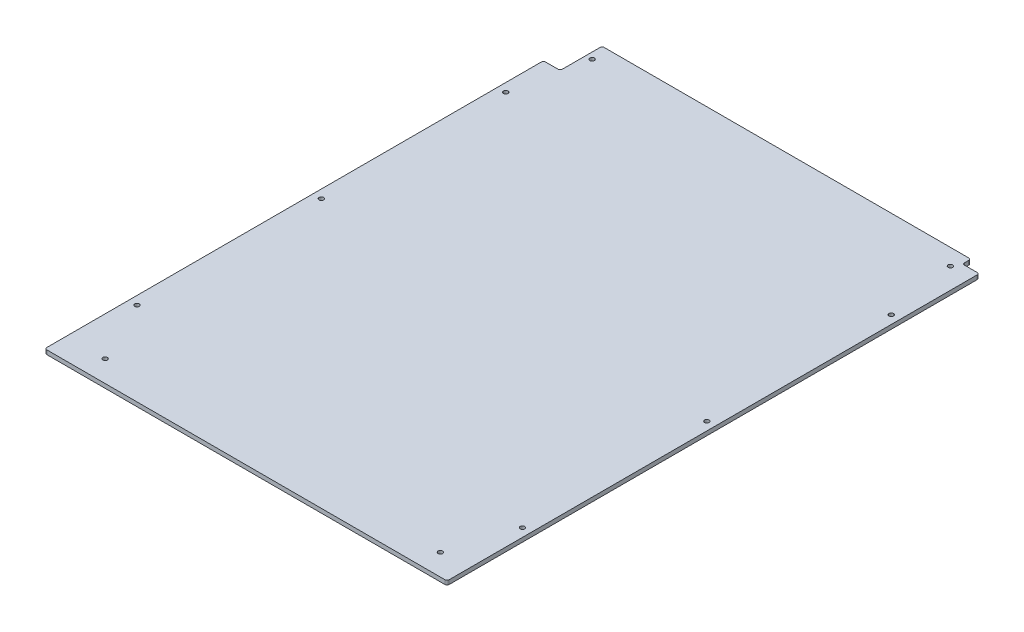
ISO-10303-21;
HEADER;
FILE_DESCRIPTION(('STEP AP214'),'2;1');
FILE_NAME('part.step','',(''),(''),'','','');
FILE_SCHEMA(('AUTOMOTIVE_DESIGN { 1 0 10303 214 1 1 1 1 }'));
ENDSEC;
DATA;
#1=APPLICATION_CONTEXT('core data for automotive mechanical design processes');
#2=APPLICATION_PROTOCOL_DEFINITION('international standard','automotive_design',2000,#1);
#3=PRODUCT_CONTEXT('',#1,'mechanical');
#4=PRODUCT('Part','Part','',(#3));
#5=PRODUCT_RELATED_PRODUCT_CATEGORY('part','',(#4));
#6=PRODUCT_DEFINITION_FORMATION('','',#4);
#7=PRODUCT_DEFINITION_CONTEXT('part definition',#1,'design');
#8=PRODUCT_DEFINITION('design','',#6,#7);
#9=PRODUCT_DEFINITION_SHAPE('','',#8);
#10=(LENGTH_UNIT() NAMED_UNIT(*) SI_UNIT(.MILLI.,.METRE.));
#11=(NAMED_UNIT(*) PLANE_ANGLE_UNIT() SI_UNIT($,.RADIAN.));
#12=(NAMED_UNIT(*) SI_UNIT($,.STERADIAN.) SOLID_ANGLE_UNIT());
#13=UNCERTAINTY_MEASURE_WITH_UNIT(LENGTH_MEASURE(1.E-05),#10,'distance_accuracy_value','');
#14=(GEOMETRIC_REPRESENTATION_CONTEXT(3) GLOBAL_UNCERTAINTY_ASSIGNED_CONTEXT((#13)) GLOBAL_UNIT_ASSIGNED_CONTEXT((#10,
#11,#12)) REPRESENTATION_CONTEXT('',''));
#15=CARTESIAN_POINT('',(0.,0.,0.));
#16=DIRECTION('',(0.,0.,1.));
#17=DIRECTION('',(1.,0.,0.));
#18=AXIS2_PLACEMENT_3D('',#15,#16,#17);
#19=CARTESIAN_POINT('',(0.,6.35,0.));
#20=DIRECTION('',(0.,-1.,0.));
#21=DIRECTION('',(0.,0.,-1.));
#22=AXIS2_PLACEMENT_3D('',#19,#20,#21);
#23=PLANE('',#22);
#24=DIRECTION('',(-1.,0.,0.));
#25=VECTOR('',#24,1.);
#26=CARTESIAN_POINT('',(25.4,6.35,-819.15));
#27=LINE('',#26,#25);
#28=CARTESIAN_POINT('',(581.025,6.35,-819.15));
#29=VERTEX_POINT('',#28);
#30=CARTESIAN_POINT('',(28.575,6.35,-819.15));
#31=VERTEX_POINT('',#30);
#32=EDGE_CURVE('E311',#29,#31,#27,.T.);
#33=ORIENTED_EDGE('',*,*,#32,.T.);
#34=CARTESIAN_POINT('',(28.575,6.35,-815.975));
#35=DIRECTION('',(0.,-1.,0.));
#36=DIRECTION('',(0.,0.,-1.));
#37=AXIS2_PLACEMENT_3D('',#34,#35,#36);
#38=CIRCLE('',#37,3.175);
#39=CARTESIAN_POINT('',(25.4,6.35,-815.975));
#40=VERTEX_POINT('',#39);
#41=EDGE_CURVE('E242',#31,#40,#38,.F.);
#42=ORIENTED_EDGE('',*,*,#41,.T.);
#43=DIRECTION('',(0.,0.,1.));
#44=VECTOR('',#43,1.);
#45=CARTESIAN_POINT('',(25.4,6.35,-755.65));
#46=LINE('',#45,#44);
#47=CARTESIAN_POINT('',(25.4,6.35,-758.825));
#48=VERTEX_POINT('',#47);
#49=EDGE_CURVE('E316',#40,#48,#46,.T.);
#50=ORIENTED_EDGE('',*,*,#49,.T.);
#51=CARTESIAN_POINT('',(22.225,6.35,-758.825));
#52=DIRECTION('',(0.,-1.,0.));
#53=DIRECTION('',(0.,0.,-1.));
#54=AXIS2_PLACEMENT_3D('',#51,#52,#53);
#55=CIRCLE('',#54,3.175);
#56=CARTESIAN_POINT('',(22.225,6.35,-755.65));
#57=VERTEX_POINT('',#56);
#58=EDGE_CURVE('E165',#48,#57,#55,.T.);
#59=ORIENTED_EDGE('',*,*,#58,.T.);
#60=DIRECTION('',(-1.,0.,0.));
#61=VECTOR('',#60,1.);
#62=CARTESIAN_POINT('',(0.,6.35,-755.65));
#63=LINE('',#62,#61);
#64=CARTESIAN_POINT('',(3.175,6.35,-755.65));
#65=VERTEX_POINT('',#64);
#66=EDGE_CURVE('E174',#57,#65,#63,.T.);
#67=ORIENTED_EDGE('',*,*,#66,.T.);
#68=CARTESIAN_POINT('',(3.175,6.35,-752.475));
#69=DIRECTION('',(0.,-1.,0.));
#70=DIRECTION('',(0.,0.,-1.));
#71=AXIS2_PLACEMENT_3D('',#68,#69,#70);
#72=CIRCLE('',#71,3.175);
#73=CARTESIAN_POINT('',(0.,6.35,-752.475));
#74=VERTEX_POINT('',#73);
#75=EDGE_CURVE('E62',#65,#74,#72,.F.);
#76=ORIENTED_EDGE('',*,*,#75,.T.);
#77=DIRECTION('',(0.,0.,1.));
#78=VECTOR('',#77,1.);
#79=CARTESIAN_POINT('',(0.,6.35,0.));
#80=LINE('',#79,#78);
#81=CARTESIAN_POINT('',(0.,6.35,-3.175));
#82=VERTEX_POINT('',#81);
#83=EDGE_CURVE('E197',#74,#82,#80,.T.);
#84=ORIENTED_EDGE('',*,*,#83,.T.);
#85=CARTESIAN_POINT('',(3.17500000000004,6.35,-3.175));
#86=DIRECTION('',(0.,-1.,0.));
#87=DIRECTION('',(0.,0.,-1.));
#88=AXIS2_PLACEMENT_3D('',#85,#86,#87);
#89=CIRCLE('',#88,3.175);
#90=CARTESIAN_POINT('',(3.17500000000026,6.35,0.));
#91=VERTEX_POINT('',#90);
#92=EDGE_CURVE('E228',#82,#91,#89,.F.);
#93=ORIENTED_EDGE('',*,*,#92,.T.);
#94=DIRECTION('',(1.,0.,0.));
#95=VECTOR('',#94,1.);
#96=CARTESIAN_POINT('',(609.6,6.35,0.));
#97=LINE('',#96,#95);
#98=CARTESIAN_POINT('',(606.425,6.35,0.));
#99=VERTEX_POINT('',#98);
#100=EDGE_CURVE('E190',#91,#99,#97,.T.);
#101=ORIENTED_EDGE('',*,*,#100,.T.);
#102=CARTESIAN_POINT('',(606.425,6.35,-3.17500000000004));
#103=DIRECTION('',(0.,-1.,0.));
#104=DIRECTION('',(0.,0.,-1.));
#105=AXIS2_PLACEMENT_3D('',#102,#103,#104);
#106=CIRCLE('',#105,3.175);
#107=CARTESIAN_POINT('',(609.6,6.35,-3.17500000000004));
#108=VERTEX_POINT('',#107);
#109=EDGE_CURVE('E231',#99,#108,#106,.F.);
#110=ORIENTED_EDGE('',*,*,#109,.T.);
#111=DIRECTION('',(0.,0.,-1.));
#112=VECTOR('',#111,1.);
#113=CARTESIAN_POINT('',(609.6,6.35,-806.45));
#114=LINE('',#113,#112);
#115=CARTESIAN_POINT('',(609.6,6.35,-803.275));
#116=VERTEX_POINT('',#115);
#117=EDGE_CURVE('E318',#108,#116,#114,.T.);
#118=ORIENTED_EDGE('',*,*,#117,.T.);
#119=CARTESIAN_POINT('',(606.425,6.35,-803.275));
#120=DIRECTION('',(0.,-1.,0.));
#121=DIRECTION('',(0.,0.,-1.));
#122=AXIS2_PLACEMENT_3D('',#119,#120,#121);
#123=CIRCLE('',#122,3.175);
#124=CARTESIAN_POINT('',(606.425,6.35,-806.45));
#125=VERTEX_POINT('',#124);
#126=EDGE_CURVE('E234',#116,#125,#123,.F.);
#127=ORIENTED_EDGE('',*,*,#126,.T.);
#128=DIRECTION('',(-1.,0.,0.));
#129=VECTOR('',#128,1.);
#130=CARTESIAN_POINT('',(584.2,6.35,-806.45));
#131=LINE('',#130,#129);
#132=CARTESIAN_POINT('',(587.375,6.35,-806.45));
#133=VERTEX_POINT('',#132);
#134=EDGE_CURVE('E306',#125,#133,#131,.T.);
#135=ORIENTED_EDGE('',*,*,#134,.T.);
#136=CARTESIAN_POINT('',(587.375,6.35,-809.625));
#137=DIRECTION('',(0.,-1.,0.));
#138=DIRECTION('',(0.,0.,-1.));
#139=AXIS2_PLACEMENT_3D('',#136,#137,#138);
#140=CIRCLE('',#139,3.175);
#141=CARTESIAN_POINT('',(584.2,6.35,-809.625));
#142=VERTEX_POINT('',#141);
#143=EDGE_CURVE('E11',#133,#142,#140,.T.);
#144=ORIENTED_EDGE('',*,*,#143,.T.);
#145=DIRECTION('',(0.,0.,-1.));
#146=VECTOR('',#145,1.);
#147=CARTESIAN_POINT('',(584.2,6.35,-819.15));
#148=LINE('',#147,#146);
#149=CARTESIAN_POINT('',(584.2,6.35,-815.975));
#150=VERTEX_POINT('',#149);
#151=EDGE_CURVE('E304',#142,#150,#148,.T.);
#152=ORIENTED_EDGE('',*,*,#151,.T.);
#153=CARTESIAN_POINT('',(581.025,6.35,-815.975));
#154=DIRECTION('',(0.,-1.,0.));
#155=DIRECTION('',(0.,0.,-1.));
#156=AXIS2_PLACEMENT_3D('',#153,#154,#155);
#157=CIRCLE('',#156,3.175);
#158=EDGE_CURVE('E237',#150,#29,#157,.F.);
#159=ORIENTED_EDGE('',*,*,#158,.T.);
#160=EDGE_LOOP('',(#33,#42,#50,#59,#67,#76,#84,#93,#101,#110,#118,#127,#135,#144,#152,#159));
#161=FACE_BOUND('',#160,.T.);
#162=CARTESIAN_POINT('',(577.85,6.35,-794.512));
#163=DIRECTION('',(0.,1.,0.));
#164=DIRECTION('',(0.,0.,1.));
#165=AXIS2_PLACEMENT_3D('',#162,#163,#164);
#166=CIRCLE('',#165,3.429);
#167=CARTESIAN_POINT('',(577.85,6.35,-791.083));
#168=VERTEX_POINT('',#167);
#169=EDGE_CURVE('E333',#168,#168,#166,.T.);
#170=ORIENTED_EDGE('',*,*,#169,.F.);
#171=EDGE_LOOP('',(#170));
#172=FACE_BOUND('',#171,.T.);
#173=CARTESIAN_POINT('',(12.7,6.35,-685.8));
#174=DIRECTION('',(0.,1.,0.));
#175=DIRECTION('',(0.,0.,1.));
#176=AXIS2_PLACEMENT_3D('',#173,#174,#175);
#177=CIRCLE('',#176,3.429);
#178=CARTESIAN_POINT('',(12.7,6.35,-682.371));
#179=VERTEX_POINT('',#178);
#180=EDGE_CURVE('E430',#179,#179,#177,.T.);
#181=ORIENTED_EDGE('',*,*,#180,.F.);
#182=EDGE_LOOP('',(#181));
#183=FACE_BOUND('',#182,.T.);
#184=CARTESIAN_POINT('',(596.9,6.35,-685.8));
#185=DIRECTION('',(0.,1.,0.));
#186=DIRECTION('',(0.,0.,1.));
#187=AXIS2_PLACEMENT_3D('',#184,#185,#186);
#188=CIRCLE('',#187,3.429);
#189=CARTESIAN_POINT('',(596.9,6.35,-682.371));
#190=VERTEX_POINT('',#189);
#191=EDGE_CURVE('E438',#190,#190,#188,.T.);
#192=ORIENTED_EDGE('',*,*,#191,.F.);
#193=EDGE_LOOP('',(#192));
#194=FACE_BOUND('',#193,.T.);
#195=CARTESIAN_POINT('',(596.900000000003,6.35,-406.4));
#196=DIRECTION('',(0.,1.,0.));
#197=DIRECTION('',(0.,0.,1.));
#198=AXIS2_PLACEMENT_3D('',#195,#196,#197);
#199=CIRCLE('',#198,3.429);
#200=CARTESIAN_POINT('',(596.900000000003,6.35,-402.971));
#201=VERTEX_POINT('',#200);
#202=EDGE_CURVE('E446',#201,#201,#199,.T.);
#203=ORIENTED_EDGE('',*,*,#202,.F.);
#204=EDGE_LOOP('',(#203));
#205=FACE_BOUND('',#204,.T.);
#206=CARTESIAN_POINT('',(596.900000000006,6.35,-127.));
#207=DIRECTION('',(0.,1.,0.));
#208=DIRECTION('',(0.,0.,1.));
#209=AXIS2_PLACEMENT_3D('',#206,#207,#208);
#210=CIRCLE('',#209,3.429);
#211=CARTESIAN_POINT('',(596.900000000006,6.35,-123.571));
#212=VERTEX_POINT('',#211);
#213=EDGE_CURVE('E454',#212,#212,#210,.T.);
#214=ORIENTED_EDGE('',*,*,#213,.F.);
#215=EDGE_LOOP('',(#214));
#216=FACE_BOUND('',#215,.T.);
#217=CARTESIAN_POINT('',(34.9250000000002,6.35,-794.511999999999));
#218=DIRECTION('',(0.,1.,0.));
#219=DIRECTION('',(0.,0.,1.));
#220=AXIS2_PLACEMENT_3D('',#217,#218,#219);
#221=CIRCLE('',#220,3.42899999999969);
#222=CARTESIAN_POINT('',(34.9250000000002,6.35,-791.082999999999));
#223=VERTEX_POINT('',#222);
#224=EDGE_CURVE('E462',#223,#223,#221,.T.);
#225=ORIENTED_EDGE('',*,*,#224,.F.);
#226=EDGE_LOOP('',(#225));
#227=FACE_BOUND('',#226,.T.);
#228=CARTESIAN_POINT('',(566.928,6.35,-32.5120000000007));
#229=DIRECTION('',(0.,1.,0.));
#230=DIRECTION('',(0.,0.,1.));
#231=AXIS2_PLACEMENT_3D('',#228,#229,#230);
#232=CIRCLE('',#231,3.42900000000045);
#233=CARTESIAN_POINT('',(566.928,6.35,-29.0830000000003));
#234=VERTEX_POINT('',#233);
#235=EDGE_CURVE('E470',#234,#234,#232,.T.);
#236=ORIENTED_EDGE('',*,*,#235,.F.);
#237=EDGE_LOOP('',(#236));
#238=FACE_BOUND('',#237,.T.);
#239=CARTESIAN_POINT('',(12.7,6.35,-406.4));
#240=DIRECTION('',(0.,1.,0.));
#241=DIRECTION('',(0.,0.,1.));
#242=AXIS2_PLACEMENT_3D('',#239,#240,#241);
#243=CIRCLE('',#242,3.429);
#244=CARTESIAN_POINT('',(12.7,6.35,-402.971));
#245=VERTEX_POINT('',#244);
#246=EDGE_CURVE('E478',#245,#245,#243,.T.);
#247=ORIENTED_EDGE('',*,*,#246,.F.);
#248=EDGE_LOOP('',(#247));
#249=FACE_BOUND('',#248,.T.);
#250=CARTESIAN_POINT('',(58.928,6.35,-32.5119999999987));
#251=DIRECTION('',(0.,1.,0.));
#252=DIRECTION('',(0.,0.,1.));
#253=AXIS2_PLACEMENT_3D('',#250,#251,#252);
#254=CIRCLE('',#253,3.429);
#255=CARTESIAN_POINT('',(58.928,6.35,-29.0829999999987));
#256=VERTEX_POINT('',#255);
#257=EDGE_CURVE('E486',#256,#256,#254,.T.);
#258=ORIENTED_EDGE('',*,*,#257,.F.);
#259=EDGE_LOOP('',(#258));
#260=FACE_BOUND('',#259,.T.);
#261=CARTESIAN_POINT('',(12.7000000000051,6.35,-127.));
#262=DIRECTION('',(0.,1.,0.));
#263=DIRECTION('',(0.,0.,1.));
#264=AXIS2_PLACEMENT_3D('',#261,#262,#263);
#265=CIRCLE('',#264,3.429);
#266=CARTESIAN_POINT('',(12.7000000000051,6.35,-123.571));
#267=VERTEX_POINT('',#266);
#268=EDGE_CURVE('E494',#267,#267,#265,.T.);
#269=ORIENTED_EDGE('',*,*,#268,.F.);
#270=EDGE_LOOP('',(#269));
#271=FACE_BOUND('',#270,.T.);
#272=ADVANCED_FACE('F39',(#161,#172,#183,#194,#205,#216,#227,#238,#249,#260,#271),#23,.F.);
#273=CARTESIAN_POINT('',(0.,0.,0.));
#274=DIRECTION('',(0.,-1.,0.));
#275=DIRECTION('',(0.,0.,-1.));
#276=AXIS2_PLACEMENT_3D('',#273,#274,#275);
#277=PLANE('',#276);
#278=CARTESIAN_POINT('',(58.928,0.,-32.5119999999987));
#279=DIRECTION('',(0.,1.,0.));
#280=DIRECTION('',(0.,0.,1.));
#281=AXIS2_PLACEMENT_3D('',#278,#279,#280);
#282=CIRCLE('',#281,3.429);
#283=CARTESIAN_POINT('',(58.928,0.,-29.0829999999987));
#284=VERTEX_POINT('',#283);
#285=EDGE_CURVE('E490',#284,#284,#282,.T.);
#286=ORIENTED_EDGE('',*,*,#285,.T.);
#287=EDGE_LOOP('',(#286));
#288=FACE_BOUND('',#287,.T.);
#289=CARTESIAN_POINT('',(566.928,0.,-32.5120000000007));
#290=DIRECTION('',(0.,1.,0.));
#291=DIRECTION('',(0.,0.,1.));
#292=AXIS2_PLACEMENT_3D('',#289,#290,#291);
#293=CIRCLE('',#292,3.42900000000045);
#294=CARTESIAN_POINT('',(566.928,0.,-29.0830000000003));
#295=VERTEX_POINT('',#294);
#296=EDGE_CURVE('E474',#295,#295,#293,.T.);
#297=ORIENTED_EDGE('',*,*,#296,.T.);
#298=EDGE_LOOP('',(#297));
#299=FACE_BOUND('',#298,.T.);
#300=CARTESIAN_POINT('',(596.900000000006,0.,-127.));
#301=DIRECTION('',(0.,1.,0.));
#302=DIRECTION('',(0.,0.,1.));
#303=AXIS2_PLACEMENT_3D('',#300,#301,#302);
#304=CIRCLE('',#303,3.429);
#305=CARTESIAN_POINT('',(596.900000000006,0.,-123.571));
#306=VERTEX_POINT('',#305);
#307=EDGE_CURVE('E458',#306,#306,#304,.T.);
#308=ORIENTED_EDGE('',*,*,#307,.T.);
#309=EDGE_LOOP('',(#308));
#310=FACE_BOUND('',#309,.T.);
#311=CARTESIAN_POINT('',(596.9,0.,-685.8));
#312=DIRECTION('',(0.,1.,0.));
#313=DIRECTION('',(0.,0.,1.));
#314=AXIS2_PLACEMENT_3D('',#311,#312,#313);
#315=CIRCLE('',#314,3.429);
#316=CARTESIAN_POINT('',(596.9,0.,-682.371));
#317=VERTEX_POINT('',#316);
#318=EDGE_CURVE('E442',#317,#317,#315,.T.);
#319=ORIENTED_EDGE('',*,*,#318,.T.);
#320=EDGE_LOOP('',(#319));
#321=FACE_BOUND('',#320,.T.);
#322=CARTESIAN_POINT('',(577.85,0.,-794.512));
#323=DIRECTION('',(0.,1.,0.));
#324=DIRECTION('',(0.,0.,1.));
#325=AXIS2_PLACEMENT_3D('',#322,#323,#324);
#326=CIRCLE('',#325,3.429);
#327=CARTESIAN_POINT('',(577.85,0.,-791.083));
#328=VERTEX_POINT('',#327);
#329=EDGE_CURVE('E426',#328,#328,#326,.T.);
#330=ORIENTED_EDGE('',*,*,#329,.T.);
#331=EDGE_LOOP('',(#330));
#332=FACE_BOUND('',#331,.T.);
#333=DIRECTION('',(0.,0.,1.));
#334=VECTOR('',#333,1.);
#335=CARTESIAN_POINT('',(25.4,0.,-755.65));
#336=LINE('',#335,#334);
#337=CARTESIAN_POINT('',(25.4,0.,-815.975));
#338=VERTEX_POINT('',#337);
#339=CARTESIAN_POINT('',(25.4,0.,-758.825));
#340=VERTEX_POINT('',#339);
#341=EDGE_CURVE('E185',#338,#340,#336,.T.);
#342=ORIENTED_EDGE('',*,*,#341,.F.);
#343=CARTESIAN_POINT('',(28.575,0.,-815.975));
#344=DIRECTION('',(0.,-1.,0.));
#345=DIRECTION('',(0.,0.,-1.));
#346=AXIS2_PLACEMENT_3D('',#343,#344,#345);
#347=CIRCLE('',#346,3.175);
#348=CARTESIAN_POINT('',(28.575,0.,-819.15));
#349=VERTEX_POINT('',#348);
#350=EDGE_CURVE('E218',#338,#349,#347,.T.);
#351=ORIENTED_EDGE('',*,*,#350,.T.);
#352=DIRECTION('',(-1.,0.,0.));
#353=VECTOR('',#352,1.);
#354=CARTESIAN_POINT('',(25.4,0.,-819.15));
#355=LINE('',#354,#353);
#356=CARTESIAN_POINT('',(581.025,0.,-819.15));
#357=VERTEX_POINT('',#356);
#358=EDGE_CURVE('E192',#357,#349,#355,.T.);
#359=ORIENTED_EDGE('',*,*,#358,.F.);
#360=CARTESIAN_POINT('',(581.025,0.,-815.975));
#361=DIRECTION('',(0.,-1.,0.));
#362=DIRECTION('',(0.,0.,-1.));
#363=AXIS2_PLACEMENT_3D('',#360,#361,#362);
#364=CIRCLE('',#363,3.175);
#365=CARTESIAN_POINT('',(584.2,0.,-815.975));
#366=VERTEX_POINT('',#365);
#367=EDGE_CURVE('E213',#357,#366,#364,.T.);
#368=ORIENTED_EDGE('',*,*,#367,.T.);
#369=DIRECTION('',(0.,0.,-1.));
#370=VECTOR('',#369,1.);
#371=CARTESIAN_POINT('',(584.2,0.,-819.15));
#372=LINE('',#371,#370);
#373=CARTESIAN_POINT('',(584.2,0.,-809.625));
#374=VERTEX_POINT('',#373);
#375=EDGE_CURVE('E286',#374,#366,#372,.T.);
#376=ORIENTED_EDGE('',*,*,#375,.F.);
#377=CARTESIAN_POINT('',(587.375,0.,-809.625));
#378=DIRECTION('',(0.,-1.,0.));
#379=DIRECTION('',(0.,0.,-1.));
#380=AXIS2_PLACEMENT_3D('',#377,#378,#379);
#381=CIRCLE('',#380,3.175);
#382=CARTESIAN_POINT('',(587.375,0.,-806.45));
#383=VERTEX_POINT('',#382);
#384=EDGE_CURVE('E48',#374,#383,#381,.F.);
#385=ORIENTED_EDGE('',*,*,#384,.T.);
#386=DIRECTION('',(-1.,0.,0.));
#387=VECTOR('',#386,1.);
#388=CARTESIAN_POINT('',(584.2,0.,-806.45));
#389=LINE('',#388,#387);
#390=CARTESIAN_POINT('',(606.425,0.,-806.45));
#391=VERTEX_POINT('',#390);
#392=EDGE_CURVE('E284',#391,#383,#389,.T.);
#393=ORIENTED_EDGE('',*,*,#392,.F.);
#394=CARTESIAN_POINT('',(606.425,0.,-803.275));
#395=DIRECTION('',(0.,-1.,0.));
#396=DIRECTION('',(0.,0.,-1.));
#397=AXIS2_PLACEMENT_3D('',#394,#395,#396);
#398=CIRCLE('',#397,3.175);
#399=CARTESIAN_POINT('',(609.6,0.,-803.275));
#400=VERTEX_POINT('',#399);
#401=EDGE_CURVE('E210',#391,#400,#398,.T.);
#402=ORIENTED_EDGE('',*,*,#401,.T.);
#403=DIRECTION('',(0.,0.,-1.));
#404=VECTOR('',#403,1.);
#405=CARTESIAN_POINT('',(609.6,0.,-806.45));
#406=LINE('',#405,#404);
#407=CARTESIAN_POINT('',(609.6,0.,-3.17500000000004));
#408=VERTEX_POINT('',#407);
#409=EDGE_CURVE('E296',#408,#400,#406,.T.);
#410=ORIENTED_EDGE('',*,*,#409,.F.);
#411=CARTESIAN_POINT('',(606.425,0.,-3.17500000000004));
#412=DIRECTION('',(0.,-1.,0.));
#413=DIRECTION('',(0.,0.,-1.));
#414=AXIS2_PLACEMENT_3D('',#411,#412,#413);
#415=CIRCLE('',#414,3.175);
#416=CARTESIAN_POINT('',(606.425,0.,0.));
#417=VERTEX_POINT('',#416);
#418=EDGE_CURVE('E207',#408,#417,#415,.T.);
#419=ORIENTED_EDGE('',*,*,#418,.T.);
#420=DIRECTION('',(1.,0.,0.));
#421=VECTOR('',#420,1.);
#422=CARTESIAN_POINT('',(609.6,0.,0.));
#423=LINE('',#422,#421);
#424=CARTESIAN_POINT('',(3.17500000000026,0.,0.));
#425=VERTEX_POINT('',#424);
#426=EDGE_CURVE('E329',#425,#417,#423,.T.);
#427=ORIENTED_EDGE('',*,*,#426,.F.);
#428=CARTESIAN_POINT('',(3.17500000000004,0.,-3.175));
#429=DIRECTION('',(0.,-1.,0.));
#430=DIRECTION('',(0.,0.,-1.));
#431=AXIS2_PLACEMENT_3D('',#428,#429,#430);
#432=CIRCLE('',#431,3.175);
#433=CARTESIAN_POINT('',(0.,0.,-3.175));
#434=VERTEX_POINT('',#433);
#435=EDGE_CURVE('E204',#425,#434,#432,.T.);
#436=ORIENTED_EDGE('',*,*,#435,.T.);
#437=DIRECTION('',(0.,0.,1.));
#438=VECTOR('',#437,1.);
#439=CARTESIAN_POINT('',(0.,0.,0.));
#440=LINE('',#439,#438);
#441=CARTESIAN_POINT('',(0.,0.,-752.475));
#442=VERTEX_POINT('',#441);
#443=EDGE_CURVE('E184',#442,#434,#440,.T.);
#444=ORIENTED_EDGE('',*,*,#443,.F.);
#445=CARTESIAN_POINT('',(3.175,0.,-752.475));
#446=DIRECTION('',(0.,-1.,0.));
#447=DIRECTION('',(0.,0.,-1.));
#448=AXIS2_PLACEMENT_3D('',#445,#446,#447);
#449=CIRCLE('',#448,3.175);
#450=CARTESIAN_POINT('',(3.175,0.,-755.65));
#451=VERTEX_POINT('',#450);
#452=EDGE_CURVE('E182',#442,#451,#449,.T.);
#453=ORIENTED_EDGE('',*,*,#452,.T.);
#454=DIRECTION('',(-1.,0.,0.));
#455=VECTOR('',#454,1.);
#456=CARTESIAN_POINT('',(0.,0.,-755.65));
#457=LINE('',#456,#455);
#458=CARTESIAN_POINT('',(22.225,0.,-755.65));
#459=VERTEX_POINT('',#458);
#460=EDGE_CURVE('E172',#459,#451,#457,.T.);
#461=ORIENTED_EDGE('',*,*,#460,.F.);
#462=CARTESIAN_POINT('',(22.225,0.,-758.825));
#463=DIRECTION('',(0.,-1.,0.));
#464=DIRECTION('',(0.,0.,-1.));
#465=AXIS2_PLACEMENT_3D('',#462,#463,#464);
#466=CIRCLE('',#465,3.175);
#467=EDGE_CURVE('E154',#459,#340,#466,.F.);
#468=ORIENTED_EDGE('',*,*,#467,.T.);
#469=EDGE_LOOP('',(#342,#351,#359,#368,#376,#385,#393,#402,#410,#419,#427,#436,#444,#453,#461,#468));
#470=FACE_BOUND('',#469,.T.);
#471=CARTESIAN_POINT('',(12.7,0.,-685.8));
#472=DIRECTION('',(0.,1.,0.));
#473=DIRECTION('',(0.,0.,1.));
#474=AXIS2_PLACEMENT_3D('',#471,#472,#473);
#475=CIRCLE('',#474,3.429);
#476=CARTESIAN_POINT('',(12.7,0.,-682.371));
#477=VERTEX_POINT('',#476);
#478=EDGE_CURVE('E434',#477,#477,#475,.T.);
#479=ORIENTED_EDGE('',*,*,#478,.T.);
#480=EDGE_LOOP('',(#479));
#481=FACE_BOUND('',#480,.T.);
#482=CARTESIAN_POINT('',(596.900000000003,0.,-406.4));
#483=DIRECTION('',(0.,1.,0.));
#484=DIRECTION('',(0.,0.,1.));
#485=AXIS2_PLACEMENT_3D('',#482,#483,#484);
#486=CIRCLE('',#485,3.429);
#487=CARTESIAN_POINT('',(596.900000000003,0.,-402.971));
#488=VERTEX_POINT('',#487);
#489=EDGE_CURVE('E450',#488,#488,#486,.T.);
#490=ORIENTED_EDGE('',*,*,#489,.T.);
#491=EDGE_LOOP('',(#490));
#492=FACE_BOUND('',#491,.T.);
#493=CARTESIAN_POINT('',(34.9250000000002,0.,-794.511999999999));
#494=DIRECTION('',(0.,1.,0.));
#495=DIRECTION('',(0.,0.,1.));
#496=AXIS2_PLACEMENT_3D('',#493,#494,#495);
#497=CIRCLE('',#496,3.42899999999969);
#498=CARTESIAN_POINT('',(34.9250000000002,0.,-791.082999999999));
#499=VERTEX_POINT('',#498);
#500=EDGE_CURVE('E466',#499,#499,#497,.T.);
#501=ORIENTED_EDGE('',*,*,#500,.T.);
#502=EDGE_LOOP('',(#501));
#503=FACE_BOUND('',#502,.T.);
#504=CARTESIAN_POINT('',(12.7,0.,-406.4));
#505=DIRECTION('',(0.,1.,0.));
#506=DIRECTION('',(0.,0.,1.));
#507=AXIS2_PLACEMENT_3D('',#504,#505,#506);
#508=CIRCLE('',#507,3.429);
#509=CARTESIAN_POINT('',(12.7,0.,-402.971));
#510=VERTEX_POINT('',#509);
#511=EDGE_CURVE('E482',#510,#510,#508,.T.);
#512=ORIENTED_EDGE('',*,*,#511,.T.);
#513=EDGE_LOOP('',(#512));
#514=FACE_BOUND('',#513,.T.);
#515=CARTESIAN_POINT('',(12.7000000000051,0.,-127.));
#516=DIRECTION('',(0.,1.,0.));
#517=DIRECTION('',(0.,0.,1.));
#518=AXIS2_PLACEMENT_3D('',#515,#516,#517);
#519=CIRCLE('',#518,3.429);
#520=CARTESIAN_POINT('',(12.7000000000051,0.,-123.571));
#521=VERTEX_POINT('',#520);
#522=EDGE_CURVE('E498',#521,#521,#519,.T.);
#523=ORIENTED_EDGE('',*,*,#522,.T.);
#524=EDGE_LOOP('',(#523));
#525=FACE_BOUND('',#524,.T.);
#526=ADVANCED_FACE('F179',(#288,#299,#310,#321,#332,#470,#481,#492,#503,#514,#525),#277,.T.);
#527=CARTESIAN_POINT('',(609.6,6.35,0.));
#528=DIRECTION('',(0.,0.,-1.));
#529=DIRECTION('',(-1.,0.,0.));
#530=AXIS2_PLACEMENT_3D('',#527,#528,#529);
#531=PLANE('',#530);
#532=ORIENTED_EDGE('',*,*,#426,.T.);
#533=DIRECTION('',(0.,-1.,0.));
#534=VECTOR('',#533,1.);
#535=CARTESIAN_POINT('',(606.425,6.35,0.));
#536=LINE('',#535,#534);
#537=EDGE_CURVE('E166',#417,#99,#536,.F.);
#538=ORIENTED_EDGE('',*,*,#537,.T.);
#539=ORIENTED_EDGE('',*,*,#100,.F.);
#540=DIRECTION('',(0.,-1.,0.));
#541=VECTOR('',#540,1.);
#542=CARTESIAN_POINT('',(3.17500000000004,6.35,0.));
#543=LINE('',#542,#541);
#544=EDGE_CURVE('E272',#91,#425,#543,.T.);
#545=ORIENTED_EDGE('',*,*,#544,.T.);
#546=EDGE_LOOP('',(#532,#538,#539,#545));
#547=FACE_BOUND('',#546,.T.);
#548=ADVANCED_FACE('F368',(#547),#531,.F.);
#549=CARTESIAN_POINT('',(609.6,6.35,-806.45));
#550=DIRECTION('',(-1.,0.,0.));
#551=DIRECTION('',(0.,0.,1.));
#552=AXIS2_PLACEMENT_3D('',#549,#550,#551);
#553=PLANE('',#552);
#554=ORIENTED_EDGE('',*,*,#409,.T.);
#555=DIRECTION('',(0.,-1.,0.));
#556=VECTOR('',#555,1.);
#557=CARTESIAN_POINT('',(609.6,6.35,-803.275));
#558=LINE('',#557,#556);
#559=EDGE_CURVE('E269',#400,#116,#558,.F.);
#560=ORIENTED_EDGE('',*,*,#559,.T.);
#561=ORIENTED_EDGE('',*,*,#117,.F.);
#562=DIRECTION('',(0.,-1.,0.));
#563=VECTOR('',#562,1.);
#564=CARTESIAN_POINT('',(609.6,6.35,-3.17500000000004));
#565=LINE('',#564,#563);
#566=EDGE_CURVE('E265',#108,#408,#565,.T.);
#567=ORIENTED_EDGE('',*,*,#566,.T.);
#568=EDGE_LOOP('',(#554,#560,#561,#567));
#569=FACE_BOUND('',#568,.T.);
#570=ADVANCED_FACE('F418',(#569),#553,.F.);
#571=CARTESIAN_POINT('',(584.2,6.35,-806.45));
#572=DIRECTION('',(0.,0.,1.));
#573=DIRECTION('',(1.,0.,0.));
#574=AXIS2_PLACEMENT_3D('',#571,#572,#573);
#575=PLANE('',#574);
#576=ORIENTED_EDGE('',*,*,#392,.T.);
#577=DIRECTION('',(0.,-1.,0.));
#578=VECTOR('',#577,1.);
#579=CARTESIAN_POINT('',(587.375,6.35,-806.45));
#580=LINE('',#579,#578);
#581=EDGE_CURVE('E262',#383,#133,#580,.F.);
#582=ORIENTED_EDGE('',*,*,#581,.T.);
#583=ORIENTED_EDGE('',*,*,#134,.F.);
#584=DIRECTION('',(0.,-1.,0.));
#585=VECTOR('',#584,1.);
#586=CARTESIAN_POINT('',(606.425,6.35,-806.45));
#587=LINE('',#586,#585);
#588=EDGE_CURVE('E258',#125,#391,#587,.T.);
#589=ORIENTED_EDGE('',*,*,#588,.T.);
#590=EDGE_LOOP('',(#576,#582,#583,#589));
#591=FACE_BOUND('',#590,.T.);
#592=ADVANCED_FACE('F291',(#591),#575,.F.);
#593=CARTESIAN_POINT('',(584.2,6.35,-819.15));
#594=DIRECTION('',(-1.,0.,0.));
#595=DIRECTION('',(0.,0.,1.));
#596=AXIS2_PLACEMENT_3D('',#593,#594,#595);
#597=PLANE('',#596);
#598=ORIENTED_EDGE('',*,*,#151,.F.);
#599=DIRECTION('',(0.,-1.,0.));
#600=VECTOR('',#599,1.);
#601=CARTESIAN_POINT('',(584.2,0.,-809.625));
#602=LINE('',#601,#600);
#603=EDGE_CURVE('E254',#142,#374,#602,.T.);
#604=ORIENTED_EDGE('',*,*,#603,.T.);
#605=ORIENTED_EDGE('',*,*,#375,.T.);
#606=DIRECTION('',(0.,-1.,0.));
#607=VECTOR('',#606,1.);
#608=CARTESIAN_POINT('',(584.2,6.35,-815.975));
#609=LINE('',#608,#607);
#610=EDGE_CURVE('E251',#366,#150,#609,.F.);
#611=ORIENTED_EDGE('',*,*,#610,.T.);
#612=EDGE_LOOP('',(#598,#604,#605,#611));
#613=FACE_BOUND('',#612,.T.);
#614=ADVANCED_FACE('F308',(#613),#597,.F.);
#615=CARTESIAN_POINT('',(25.4,6.35,-819.15));
#616=DIRECTION('',(0.,0.,1.));
#617=DIRECTION('',(1.,0.,0.));
#618=AXIS2_PLACEMENT_3D('',#615,#616,#617);
#619=PLANE('',#618);
#620=ORIENTED_EDGE('',*,*,#358,.T.);
#621=DIRECTION('',(0.,-1.,0.));
#622=VECTOR('',#621,1.);
#623=CARTESIAN_POINT('',(28.575,6.35,-819.15));
#624=LINE('',#623,#622);
#625=EDGE_CURVE('E225',#349,#31,#624,.F.);
#626=ORIENTED_EDGE('',*,*,#625,.T.);
#627=ORIENTED_EDGE('',*,*,#32,.F.);
#628=DIRECTION('',(0.,-1.,0.));
#629=VECTOR('',#628,1.);
#630=CARTESIAN_POINT('',(581.025,6.35,-819.15));
#631=LINE('',#630,#629);
#632=EDGE_CURVE('E221',#29,#357,#631,.T.);
#633=ORIENTED_EDGE('',*,*,#632,.T.);
#634=EDGE_LOOP('',(#620,#626,#627,#633));
#635=FACE_BOUND('',#634,.T.);
#636=ADVANCED_FACE('F344',(#635),#619,.F.);
#637=CARTESIAN_POINT('',(25.4,6.35,-755.65));
#638=DIRECTION('',(1.,0.,0.));
#639=DIRECTION('',(0.,0.,-1.));
#640=AXIS2_PLACEMENT_3D('',#637,#638,#639);
#641=PLANE('',#640);
#642=ORIENTED_EDGE('',*,*,#341,.T.);
#643=DIRECTION('',(0.,-1.,0.));
#644=VECTOR('',#643,1.);
#645=CARTESIAN_POINT('',(25.4,6.35,-758.825));
#646=LINE('',#645,#644);
#647=EDGE_CURVE('E159',#340,#48,#646,.F.);
#648=ORIENTED_EDGE('',*,*,#647,.T.);
#649=ORIENTED_EDGE('',*,*,#49,.F.);
#650=DIRECTION('',(0.,-1.,0.));
#651=VECTOR('',#650,1.);
#652=CARTESIAN_POINT('',(25.4,6.35,-815.975));
#653=LINE('',#652,#651);
#654=EDGE_CURVE('E176',#40,#338,#653,.T.);
#655=ORIENTED_EDGE('',*,*,#654,.T.);
#656=EDGE_LOOP('',(#642,#648,#649,#655));
#657=FACE_BOUND('',#656,.T.);
#658=ADVANCED_FACE('F353',(#657),#641,.F.);
#659=CARTESIAN_POINT('',(0.,6.35,-755.65));
#660=DIRECTION('',(0.,0.,1.));
#661=DIRECTION('',(1.,0.,0.));
#662=AXIS2_PLACEMENT_3D('',#659,#660,#661);
#663=PLANE('',#662);
#664=ORIENTED_EDGE('',*,*,#66,.F.);
#665=DIRECTION('',(0.,-1.,0.));
#666=VECTOR('',#665,1.);
#667=CARTESIAN_POINT('',(22.225,0.,-755.65));
#668=LINE('',#667,#666);
#669=EDGE_CURVE('E158',#57,#459,#668,.T.);
#670=ORIENTED_EDGE('',*,*,#669,.T.);
#671=ORIENTED_EDGE('',*,*,#460,.T.);
#672=DIRECTION('',(0.,-1.,0.));
#673=VECTOR('',#672,1.);
#674=CARTESIAN_POINT('',(3.175,6.35,-755.65));
#675=LINE('',#674,#673);
#676=EDGE_CURVE('E177',#451,#65,#675,.F.);
#677=ORIENTED_EDGE('',*,*,#676,.T.);
#678=EDGE_LOOP('',(#664,#670,#671,#677));
#679=FACE_BOUND('',#678,.T.);
#680=ADVANCED_FACE('F171',(#679),#663,.F.);
#681=CARTESIAN_POINT('',(0.,6.35,0.));
#682=DIRECTION('',(1.,0.,0.));
#683=DIRECTION('',(0.,0.,-1.));
#684=AXIS2_PLACEMENT_3D('',#681,#682,#683);
#685=PLANE('',#684);
#686=ORIENTED_EDGE('',*,*,#83,.F.);
#687=DIRECTION('',(0.,-1.,0.));
#688=VECTOR('',#687,1.);
#689=CARTESIAN_POINT('',(0.,6.35,-752.475));
#690=LINE('',#689,#688);
#691=EDGE_CURVE('E247',#74,#442,#690,.T.);
#692=ORIENTED_EDGE('',*,*,#691,.T.);
#693=ORIENTED_EDGE('',*,*,#443,.T.);
#694=DIRECTION('',(0.,-1.,0.));
#695=VECTOR('',#694,1.);
#696=CARTESIAN_POINT('',(0.,6.35,-3.175));
#697=LINE('',#696,#695);
#698=EDGE_CURVE('E55',#434,#82,#697,.F.);
#699=ORIENTED_EDGE('',*,*,#698,.T.);
#700=EDGE_LOOP('',(#686,#692,#693,#699));
#701=FACE_BOUND('',#700,.T.);
#702=ADVANCED_FACE('F360',(#701),#685,.F.);
#703=CARTESIAN_POINT('',(577.85,6.35,-794.512));
#704=DIRECTION('',(0.,-1.,0.));
#705=DIRECTION('',(0.,0.,-1.));
#706=AXIS2_PLACEMENT_3D('',#703,#704,#705);
#707=CYLINDRICAL_SURFACE('',#706,3.429);
#708=ORIENTED_EDGE('',*,*,#169,.T.);
#709=EDGE_LOOP('',(#708));
#710=FACE_BOUND('',#709,.T.);
#711=ORIENTED_EDGE('',*,*,#329,.F.);
#712=EDGE_LOOP('',(#711));
#713=FACE_BOUND('',#712,.T.);
#714=ADVANCED_FACE('F372',(#710,#713),#707,.F.);
#715=CARTESIAN_POINT('',(12.7,6.35,-685.8));
#716=DIRECTION('',(0.,-1.,0.));
#717=DIRECTION('',(0.,0.,-1.));
#718=AXIS2_PLACEMENT_3D('',#715,#716,#717);
#719=CYLINDRICAL_SURFACE('',#718,3.429);
#720=ORIENTED_EDGE('',*,*,#180,.T.);
#721=EDGE_LOOP('',(#720));
#722=FACE_BOUND('',#721,.T.);
#723=ORIENTED_EDGE('',*,*,#478,.F.);
#724=EDGE_LOOP('',(#723));
#725=FACE_BOUND('',#724,.T.);
#726=ADVANCED_FACE('F379',(#722,#725),#719,.F.);
#727=CARTESIAN_POINT('',(596.9,6.35,-685.8));
#728=DIRECTION('',(0.,-1.,0.));
#729=DIRECTION('',(0.,0.,-1.));
#730=AXIS2_PLACEMENT_3D('',#727,#728,#729);
#731=CYLINDRICAL_SURFACE('',#730,3.429);
#732=ORIENTED_EDGE('',*,*,#191,.T.);
#733=EDGE_LOOP('',(#732));
#734=FACE_BOUND('',#733,.T.);
#735=ORIENTED_EDGE('',*,*,#318,.F.);
#736=EDGE_LOOP('',(#735));
#737=FACE_BOUND('',#736,.T.);
#738=ADVANCED_FACE('F541',(#734,#737),#731,.F.);
#739=CARTESIAN_POINT('',(596.900000000003,6.35,-406.4));
#740=DIRECTION('',(0.,-1.,0.));
#741=DIRECTION('',(0.,0.,-1.));
#742=AXIS2_PLACEMENT_3D('',#739,#740,#741);
#743=CYLINDRICAL_SURFACE('',#742,3.429);
#744=ORIENTED_EDGE('',*,*,#202,.T.);
#745=EDGE_LOOP('',(#744));
#746=FACE_BOUND('',#745,.T.);
#747=ORIENTED_EDGE('',*,*,#489,.F.);
#748=EDGE_LOOP('',(#747));
#749=FACE_BOUND('',#748,.T.);
#750=ADVANCED_FACE('F537',(#746,#749),#743,.F.);
#751=CARTESIAN_POINT('',(596.900000000006,6.35,-127.));
#752=DIRECTION('',(0.,-1.,0.));
#753=DIRECTION('',(0.,0.,-1.));
#754=AXIS2_PLACEMENT_3D('',#751,#752,#753);
#755=CYLINDRICAL_SURFACE('',#754,3.429);
#756=ORIENTED_EDGE('',*,*,#213,.T.);
#757=EDGE_LOOP('',(#756));
#758=FACE_BOUND('',#757,.T.);
#759=ORIENTED_EDGE('',*,*,#307,.F.);
#760=EDGE_LOOP('',(#759));
#761=FACE_BOUND('',#760,.T.);
#762=ADVANCED_FACE('F533',(#758,#761),#755,.F.);
#763=CARTESIAN_POINT('',(34.9250000000002,6.35,-794.511999999999));
#764=DIRECTION('',(0.,-1.,0.));
#765=DIRECTION('',(0.,0.,-1.));
#766=AXIS2_PLACEMENT_3D('',#763,#764,#765);
#767=CYLINDRICAL_SURFACE('',#766,3.42899999999969);
#768=ORIENTED_EDGE('',*,*,#224,.T.);
#769=EDGE_LOOP('',(#768));
#770=FACE_BOUND('',#769,.T.);
#771=ORIENTED_EDGE('',*,*,#500,.F.);
#772=EDGE_LOOP('',(#771));
#773=FACE_BOUND('',#772,.T.);
#774=ADVANCED_FACE('F529',(#770,#773),#767,.F.);
#775=CARTESIAN_POINT('',(566.928,6.35,-32.5120000000007));
#776=DIRECTION('',(0.,-1.,0.));
#777=DIRECTION('',(0.,0.,-1.));
#778=AXIS2_PLACEMENT_3D('',#775,#776,#777);
#779=CYLINDRICAL_SURFACE('',#778,3.42900000000045);
#780=ORIENTED_EDGE('',*,*,#235,.T.);
#781=EDGE_LOOP('',(#780));
#782=FACE_BOUND('',#781,.T.);
#783=ORIENTED_EDGE('',*,*,#296,.F.);
#784=EDGE_LOOP('',(#783));
#785=FACE_BOUND('',#784,.T.);
#786=ADVANCED_FACE('F525',(#782,#785),#779,.F.);
#787=CARTESIAN_POINT('',(12.7,6.35,-406.4));
#788=DIRECTION('',(0.,-1.,0.));
#789=DIRECTION('',(0.,0.,-1.));
#790=AXIS2_PLACEMENT_3D('',#787,#788,#789);
#791=CYLINDRICAL_SURFACE('',#790,3.429);
#792=ORIENTED_EDGE('',*,*,#246,.T.);
#793=EDGE_LOOP('',(#792));
#794=FACE_BOUND('',#793,.T.);
#795=ORIENTED_EDGE('',*,*,#511,.F.);
#796=EDGE_LOOP('',(#795));
#797=FACE_BOUND('',#796,.T.);
#798=ADVANCED_FACE('F519',(#794,#797),#791,.F.);
#799=CARTESIAN_POINT('',(58.928,6.35,-32.5119999999987));
#800=DIRECTION('',(0.,-1.,0.));
#801=DIRECTION('',(0.,0.,-1.));
#802=AXIS2_PLACEMENT_3D('',#799,#800,#801);
#803=CYLINDRICAL_SURFACE('',#802,3.429);
#804=ORIENTED_EDGE('',*,*,#257,.T.);
#805=EDGE_LOOP('',(#804));
#806=FACE_BOUND('',#805,.T.);
#807=ORIENTED_EDGE('',*,*,#285,.F.);
#808=EDGE_LOOP('',(#807));
#809=FACE_BOUND('',#808,.T.);
#810=ADVANCED_FACE('F511',(#806,#809),#803,.F.);
#811=CARTESIAN_POINT('',(12.7000000000051,6.35,-127.));
#812=DIRECTION('',(0.,-1.,0.));
#813=DIRECTION('',(0.,0.,-1.));
#814=AXIS2_PLACEMENT_3D('',#811,#812,#813);
#815=CYLINDRICAL_SURFACE('',#814,3.429);
#816=ORIENTED_EDGE('',*,*,#268,.T.);
#817=EDGE_LOOP('',(#816));
#818=FACE_BOUND('',#817,.T.);
#819=ORIENTED_EDGE('',*,*,#522,.F.);
#820=EDGE_LOOP('',(#819));
#821=FACE_BOUND('',#820,.T.);
#822=ADVANCED_FACE('F507',(#818,#821),#815,.F.);
#823=CARTESIAN_POINT('',(22.225,6.35,-758.825));
#824=DIRECTION('',(0.,1.,0.));
#825=DIRECTION('',(0.,0.,1.));
#826=AXIS2_PLACEMENT_3D('',#823,#824,#825);
#827=CYLINDRICAL_SURFACE('',#826,3.175);
#828=ORIENTED_EDGE('',*,*,#58,.F.);
#829=ORIENTED_EDGE('',*,*,#647,.F.);
#830=ORIENTED_EDGE('',*,*,#467,.F.);
#831=ORIENTED_EDGE('',*,*,#669,.F.);
#832=EDGE_LOOP('',(#828,#829,#830,#831));
#833=FACE_BOUND('',#832,.T.);
#834=ADVANCED_FACE('F157',(#833),#827,.F.);
#835=CARTESIAN_POINT('',(28.575,6.35,-815.975));
#836=DIRECTION('',(0.,-1.,0.));
#837=DIRECTION('',(0.,0.,-1.));
#838=AXIS2_PLACEMENT_3D('',#835,#836,#837);
#839=CYLINDRICAL_SURFACE('',#838,3.175);
#840=ORIENTED_EDGE('',*,*,#41,.F.);
#841=ORIENTED_EDGE('',*,*,#625,.F.);
#842=ORIENTED_EDGE('',*,*,#350,.F.);
#843=ORIENTED_EDGE('',*,*,#654,.F.);
#844=EDGE_LOOP('',(#840,#841,#842,#843));
#845=FACE_BOUND('',#844,.T.);
#846=ADVANCED_FACE('F349',(#845),#839,.T.);
#847=CARTESIAN_POINT('',(3.175,6.35,-752.475));
#848=DIRECTION('',(0.,-1.,0.));
#849=DIRECTION('',(0.,0.,-1.));
#850=AXIS2_PLACEMENT_3D('',#847,#848,#849);
#851=CYLINDRICAL_SURFACE('',#850,3.175);
#852=ORIENTED_EDGE('',*,*,#75,.F.);
#853=ORIENTED_EDGE('',*,*,#676,.F.);
#854=ORIENTED_EDGE('',*,*,#452,.F.);
#855=ORIENTED_EDGE('',*,*,#691,.F.);
#856=EDGE_LOOP('',(#852,#853,#854,#855));
#857=FACE_BOUND('',#856,.T.);
#858=ADVANCED_FACE('F384',(#857),#851,.T.);
#859=CARTESIAN_POINT('',(587.375,6.35,-809.625));
#860=DIRECTION('',(0.,1.,0.));
#861=DIRECTION('',(0.,0.,1.));
#862=AXIS2_PLACEMENT_3D('',#859,#860,#861);
#863=CYLINDRICAL_SURFACE('',#862,3.175);
#864=ORIENTED_EDGE('',*,*,#143,.F.);
#865=ORIENTED_EDGE('',*,*,#581,.F.);
#866=ORIENTED_EDGE('',*,*,#384,.F.);
#867=ORIENTED_EDGE('',*,*,#603,.F.);
#868=EDGE_LOOP('',(#864,#865,#866,#867));
#869=FACE_BOUND('',#868,.T.);
#870=ADVANCED_FACE('F299',(#869),#863,.F.);
#871=CARTESIAN_POINT('',(581.025,6.35,-815.975));
#872=DIRECTION('',(0.,-1.,0.));
#873=DIRECTION('',(0.,0.,-1.));
#874=AXIS2_PLACEMENT_3D('',#871,#872,#873);
#875=CYLINDRICAL_SURFACE('',#874,3.175);
#876=ORIENTED_EDGE('',*,*,#158,.F.);
#877=ORIENTED_EDGE('',*,*,#610,.F.);
#878=ORIENTED_EDGE('',*,*,#367,.F.);
#879=ORIENTED_EDGE('',*,*,#632,.F.);
#880=EDGE_LOOP('',(#876,#877,#878,#879));
#881=FACE_BOUND('',#880,.T.);
#882=ADVANCED_FACE('F391',(#881),#875,.T.);
#883=CARTESIAN_POINT('',(606.425,6.35,-803.275));
#884=DIRECTION('',(0.,-1.,0.));
#885=DIRECTION('',(0.,0.,-1.));
#886=AXIS2_PLACEMENT_3D('',#883,#884,#885);
#887=CYLINDRICAL_SURFACE('',#886,3.175);
#888=ORIENTED_EDGE('',*,*,#126,.F.);
#889=ORIENTED_EDGE('',*,*,#559,.F.);
#890=ORIENTED_EDGE('',*,*,#401,.F.);
#891=ORIENTED_EDGE('',*,*,#588,.F.);
#892=EDGE_LOOP('',(#888,#889,#890,#891));
#893=FACE_BOUND('',#892,.T.);
#894=ADVANCED_FACE('F398',(#893),#887,.T.);
#895=CARTESIAN_POINT('',(606.425,6.35,-3.17500000000004));
#896=DIRECTION('',(0.,-1.,0.));
#897=DIRECTION('',(0.,0.,-1.));
#898=AXIS2_PLACEMENT_3D('',#895,#896,#897);
#899=CYLINDRICAL_SURFACE('',#898,3.175);
#900=ORIENTED_EDGE('',*,*,#109,.F.);
#901=ORIENTED_EDGE('',*,*,#537,.F.);
#902=ORIENTED_EDGE('',*,*,#418,.F.);
#903=ORIENTED_EDGE('',*,*,#566,.F.);
#904=EDGE_LOOP('',(#900,#901,#902,#903));
#905=FACE_BOUND('',#904,.T.);
#906=ADVANCED_FACE('F401',(#905),#899,.T.);
#907=CARTESIAN_POINT('',(3.17500000000004,6.35,-3.175));
#908=DIRECTION('',(0.,-1.,0.));
#909=DIRECTION('',(0.,0.,-1.));
#910=AXIS2_PLACEMENT_3D('',#907,#908,#909);
#911=CYLINDRICAL_SURFACE('',#910,3.175);
#912=ORIENTED_EDGE('',*,*,#92,.F.);
#913=ORIENTED_EDGE('',*,*,#698,.F.);
#914=ORIENTED_EDGE('',*,*,#435,.F.);
#915=ORIENTED_EDGE('',*,*,#544,.F.);
#916=EDGE_LOOP('',(#912,#913,#914,#915));
#917=FACE_BOUND('',#916,.T.);
#918=ADVANCED_FACE('F41',(#917),#911,.T.);
#919=CLOSED_SHELL('',(#272,#526,#548,#570,#592,#614,#636,#658,#680,#702,#714,#726,#738,#750,
#762,#774,#786,#798,#810,#822,#834,#846,#858,#870,#882,#894,#906,#918));
#920=MANIFOLD_SOLID_BREP('B2',#919);
#921=ADVANCED_BREP_SHAPE_REPRESENTATION('',(#18,#920),#14);
#922=SHAPE_DEFINITION_REPRESENTATION(#9,#921);
ENDSEC;
END-ISO-10303-21;
